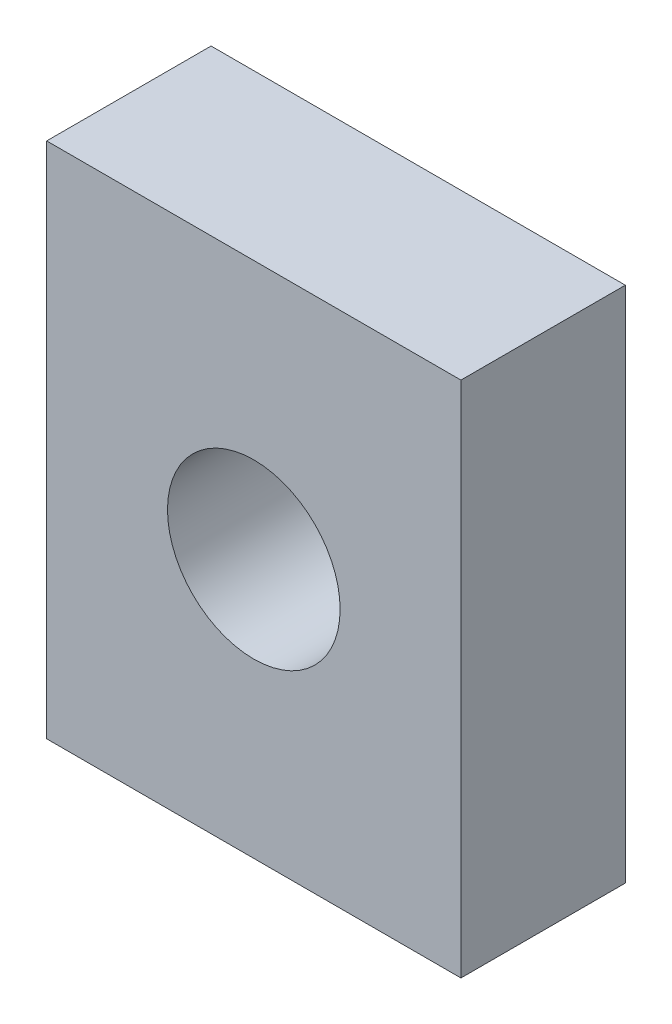
ISO-10303-21;
HEADER;
FILE_DESCRIPTION(('STEP AP214'),'2;1');
FILE_NAME('part.step','',(''),(''),'','','');
FILE_SCHEMA(('AUTOMOTIVE_DESIGN { 1 0 10303 214 1 1 1 1 }'));
ENDSEC;
DATA;
#1=APPLICATION_CONTEXT('core data for automotive mechanical design processes');
#2=APPLICATION_PROTOCOL_DEFINITION('international standard','automotive_design',2000,#1);
#3=PRODUCT_CONTEXT('',#1,'mechanical');
#4=PRODUCT('Part','Part','',(#3));
#5=PRODUCT_RELATED_PRODUCT_CATEGORY('part','',(#4));
#6=PRODUCT_DEFINITION_FORMATION('','',#4);
#7=PRODUCT_DEFINITION_CONTEXT('part definition',#1,'design');
#8=PRODUCT_DEFINITION('design','',#6,#7);
#9=PRODUCT_DEFINITION_SHAPE('','',#8);
#10=(LENGTH_UNIT() NAMED_UNIT(*) SI_UNIT(.MILLI.,.METRE.));
#11=(NAMED_UNIT(*) PLANE_ANGLE_UNIT() SI_UNIT($,.RADIAN.));
#12=(NAMED_UNIT(*) SI_UNIT($,.STERADIAN.) SOLID_ANGLE_UNIT());
#13=UNCERTAINTY_MEASURE_WITH_UNIT(LENGTH_MEASURE(1.E-05),#10,'distance_accuracy_value','');
#14=(GEOMETRIC_REPRESENTATION_CONTEXT(3) GLOBAL_UNCERTAINTY_ASSIGNED_CONTEXT((#13)) GLOBAL_UNIT_ASSIGNED_CONTEXT((#10,
#11,#12)) REPRESENTATION_CONTEXT('',''));
#15=CARTESIAN_POINT('',(0.,0.,0.));
#16=DIRECTION('',(0.,0.,1.));
#17=DIRECTION('',(1.,0.,0.));
#18=AXIS2_PLACEMENT_3D('',#15,#16,#17);
#19=CARTESIAN_POINT('',(60.,-75.,47.6190476190476));
#20=DIRECTION('',(0.,0.,1.));
#21=DIRECTION('',(1.,0.,0.));
#22=AXIS2_PLACEMENT_3D('',#19,#20,#21);
#23=PLANE('',#22);
#24=DIRECTION('',(0.,1.,0.));
#25=VECTOR('',#24,1.);
#26=CARTESIAN_POINT('',(60.,75.,47.6190476190476));
#27=LINE('',#26,#25);
#28=CARTESIAN_POINT('',(60.,-75.,47.6190476190476));
#29=VERTEX_POINT('',#28);
#30=CARTESIAN_POINT('',(60.,75.,47.6190476190476));
#31=VERTEX_POINT('',#30);
#32=EDGE_CURVE('E89',#29,#31,#27,.T.);
#33=ORIENTED_EDGE('',*,*,#32,.T.);
#34=DIRECTION('',(-1.,0.,0.));
#35=VECTOR('',#34,1.);
#36=CARTESIAN_POINT('',(-60.,75.,47.6190476190476));
#37=LINE('',#36,#35);
#38=CARTESIAN_POINT('',(-60.,75.,47.6190476190476));
#39=VERTEX_POINT('',#38);
#40=EDGE_CURVE('E84',#31,#39,#37,.T.);
#41=ORIENTED_EDGE('',*,*,#40,.T.);
#42=DIRECTION('',(0.,-1.,0.));
#43=VECTOR('',#42,1.);
#44=CARTESIAN_POINT('',(-60.,75.,47.6190476190476));
#45=LINE('',#44,#43);
#46=CARTESIAN_POINT('',(-60.,-75.,47.6190476190476));
#47=VERTEX_POINT('',#46);
#48=EDGE_CURVE('E87',#39,#47,#45,.T.);
#49=ORIENTED_EDGE('',*,*,#48,.T.);
#50=DIRECTION('',(1.,0.,0.));
#51=VECTOR('',#50,1.);
#52=CARTESIAN_POINT('',(-60.,-75.,47.6190476190476));
#53=LINE('',#52,#51);
#54=EDGE_CURVE('E54',#47,#29,#53,.T.);
#55=ORIENTED_EDGE('',*,*,#54,.T.);
#56=EDGE_LOOP('',(#33,#41,#49,#55));
#57=FACE_BOUND('',#56,.T.);
#58=CARTESIAN_POINT('',(0.,0.,47.6190476190476));
#59=DIRECTION('',(0.,0.,1.));
#60=DIRECTION('',(1.,0.,0.));
#61=AXIS2_PLACEMENT_3D('',#58,#59,#60);
#62=CIRCLE('',#61,25.);
#63=CARTESIAN_POINT('',(-25.,0.,47.6190476190476));
#64=VERTEX_POINT('',#63);
#65=EDGE_CURVE('E104',#64,#64,#62,.T.);
#66=ORIENTED_EDGE('',*,*,#65,.F.);
#67=EDGE_LOOP('',(#66));
#68=FACE_BOUND('',#67,.T.);
#69=ADVANCED_FACE('F37',(#57,#68),#23,.T.);
#70=CARTESIAN_POINT('',(60.,-75.,0.));
#71=DIRECTION('',(0.,0.,1.));
#72=DIRECTION('',(1.,0.,0.));
#73=AXIS2_PLACEMENT_3D('',#70,#71,#72);
#74=PLANE('',#73);
#75=DIRECTION('',(0.,1.,0.));
#76=VECTOR('',#75,1.);
#77=CARTESIAN_POINT('',(60.,75.,0.));
#78=LINE('',#77,#76);
#79=CARTESIAN_POINT('',(60.,-75.,0.));
#80=VERTEX_POINT('',#79);
#81=CARTESIAN_POINT('',(60.,75.,0.));
#82=VERTEX_POINT('',#81);
#83=EDGE_CURVE('E101',#80,#82,#78,.T.);
#84=ORIENTED_EDGE('',*,*,#83,.F.);
#85=DIRECTION('',(1.,0.,0.));
#86=VECTOR('',#85,1.);
#87=CARTESIAN_POINT('',(-60.,-75.,0.));
#88=LINE('',#87,#86);
#89=CARTESIAN_POINT('',(-60.,-75.,0.));
#90=VERTEX_POINT('',#89);
#91=EDGE_CURVE('E77',#90,#80,#88,.T.);
#92=ORIENTED_EDGE('',*,*,#91,.F.);
#93=DIRECTION('',(0.,-1.,0.));
#94=VECTOR('',#93,1.);
#95=CARTESIAN_POINT('',(-60.,75.,0.));
#96=LINE('',#95,#94);
#97=CARTESIAN_POINT('',(-60.,75.,0.));
#98=VERTEX_POINT('',#97);
#99=EDGE_CURVE('E71',#98,#90,#96,.T.);
#100=ORIENTED_EDGE('',*,*,#99,.F.);
#101=DIRECTION('',(-1.,0.,0.));
#102=VECTOR('',#101,1.);
#103=CARTESIAN_POINT('',(-60.,75.,0.));
#104=LINE('',#103,#102);
#105=EDGE_CURVE('E93',#82,#98,#104,.T.);
#106=ORIENTED_EDGE('',*,*,#105,.F.);
#107=EDGE_LOOP('',(#84,#92,#100,#106));
#108=FACE_BOUND('',#107,.T.);
#109=CARTESIAN_POINT('',(0.,0.,0.));
#110=DIRECTION('',(0.,0.,1.));
#111=DIRECTION('',(1.,0.,0.));
#112=AXIS2_PLACEMENT_3D('',#109,#110,#111);
#113=CIRCLE('',#112,25.);
#114=CARTESIAN_POINT('',(-25.,0.,0.));
#115=VERTEX_POINT('',#114);
#116=EDGE_CURVE('E116',#115,#115,#113,.T.);
#117=ORIENTED_EDGE('',*,*,#116,.T.);
#118=EDGE_LOOP('',(#117));
#119=FACE_BOUND('',#118,.T.);
#120=ADVANCED_FACE('F112',(#108,#119),#74,.F.);
#121=CARTESIAN_POINT('',(60.,75.,47.6190476190476));
#122=DIRECTION('',(-1.,0.,0.));
#123=DIRECTION('',(0.,-1.,0.));
#124=AXIS2_PLACEMENT_3D('',#121,#122,#123);
#125=PLANE('',#124);
#126=ORIENTED_EDGE('',*,*,#83,.T.);
#127=DIRECTION('',(0.,0.,-1.));
#128=VECTOR('',#127,1.);
#129=CARTESIAN_POINT('',(60.,75.,47.6190476190476));
#130=LINE('',#129,#128);
#131=EDGE_CURVE('E11',#31,#82,#130,.T.);
#132=ORIENTED_EDGE('',*,*,#131,.F.);
#133=ORIENTED_EDGE('',*,*,#32,.F.);
#134=DIRECTION('',(0.,0.,-1.));
#135=VECTOR('',#134,1.);
#136=CARTESIAN_POINT('',(60.,-75.,47.6190476190476));
#137=LINE('',#136,#135);
#138=EDGE_CURVE('E97',#29,#80,#137,.T.);
#139=ORIENTED_EDGE('',*,*,#138,.T.);
#140=EDGE_LOOP('',(#126,#132,#133,#139));
#141=FACE_BOUND('',#140,.T.);
#142=ADVANCED_FACE('F39',(#141),#125,.F.);
#143=CARTESIAN_POINT('',(-60.,75.,47.6190476190476));
#144=DIRECTION('',(0.,-1.,0.));
#145=DIRECTION('',(0.,0.,-1.));
#146=AXIS2_PLACEMENT_3D('',#143,#144,#145);
#147=PLANE('',#146);
#148=ORIENTED_EDGE('',*,*,#105,.T.);
#149=DIRECTION('',(0.,0.,-1.));
#150=VECTOR('',#149,1.);
#151=CARTESIAN_POINT('',(-60.,75.,47.6190476190476));
#152=LINE('',#151,#150);
#153=EDGE_CURVE('E46',#39,#98,#152,.T.);
#154=ORIENTED_EDGE('',*,*,#153,.F.);
#155=ORIENTED_EDGE('',*,*,#40,.F.);
#156=ORIENTED_EDGE('',*,*,#131,.T.);
#157=EDGE_LOOP('',(#148,#154,#155,#156));
#158=FACE_BOUND('',#157,.T.);
#159=ADVANCED_FACE('F92',(#158),#147,.F.);
#160=CARTESIAN_POINT('',(-60.,75.,47.6190476190476));
#161=DIRECTION('',(1.,0.,0.));
#162=DIRECTION('',(0.,1.,0.));
#163=AXIS2_PLACEMENT_3D('',#160,#161,#162);
#164=PLANE('',#163);
#165=ORIENTED_EDGE('',*,*,#99,.T.);
#166=DIRECTION('',(0.,0.,-1.));
#167=VECTOR('',#166,1.);
#168=CARTESIAN_POINT('',(-60.,-75.,47.6190476190476));
#169=LINE('',#168,#167);
#170=EDGE_CURVE('E94',#47,#90,#169,.T.);
#171=ORIENTED_EDGE('',*,*,#170,.F.);
#172=ORIENTED_EDGE('',*,*,#48,.F.);
#173=ORIENTED_EDGE('',*,*,#153,.T.);
#174=EDGE_LOOP('',(#165,#171,#172,#173));
#175=FACE_BOUND('',#174,.T.);
#176=ADVANCED_FACE('F95',(#175),#164,.F.);
#177=CARTESIAN_POINT('',(-60.,-75.,47.6190476190476));
#178=DIRECTION('',(0.,1.,0.));
#179=DIRECTION('',(0.,0.,1.));
#180=AXIS2_PLACEMENT_3D('',#177,#178,#179);
#181=PLANE('',#180);
#182=ORIENTED_EDGE('',*,*,#91,.T.);
#183=ORIENTED_EDGE('',*,*,#138,.F.);
#184=ORIENTED_EDGE('',*,*,#54,.F.);
#185=ORIENTED_EDGE('',*,*,#170,.T.);
#186=EDGE_LOOP('',(#182,#183,#184,#185));
#187=FACE_BOUND('',#186,.T.);
#188=ADVANCED_FACE('F109',(#187),#181,.F.);
#189=CARTESIAN_POINT('',(0.,0.,47.6190476190476));
#190=DIRECTION('',(0.,0.,-1.));
#191=DIRECTION('',(-1.,0.,0.));
#192=AXIS2_PLACEMENT_3D('',#189,#190,#191);
#193=CYLINDRICAL_SURFACE('',#192,25.);
#194=CARTESIAN_POINT('',(-25.,0.,47.6190476190476));
#195=CARTESIAN_POINT('',(-25.,0.,47.1230158730159));
#196=CARTESIAN_POINT('',(-25.,0.,46.6269841269841));
#197=CARTESIAN_POINT('',(-25.,0.,45.6349206349206));
#198=CARTESIAN_POINT('',(-25.,0.,45.1388888888889));
#199=CARTESIAN_POINT('',(-25.,0.,44.1468253968254));
#200=CARTESIAN_POINT('',(-25.,0.,43.6507936507936));
#201=CARTESIAN_POINT('',(-25.,0.,42.6587301587302));
#202=CARTESIAN_POINT('',(-25.,0.,42.1626984126984));
#203=CARTESIAN_POINT('',(-25.,0.,41.1706349206349));
#204=CARTESIAN_POINT('',(-25.,0.,40.6746031746032));
#205=CARTESIAN_POINT('',(-25.,0.,39.6825396825397));
#206=CARTESIAN_POINT('',(-25.,0.,39.1865079365079));
#207=CARTESIAN_POINT('',(-25.,0.,38.1944444444444));
#208=CARTESIAN_POINT('',(-25.,0.,37.6984126984127));
#209=CARTESIAN_POINT('',(-25.,0.,36.7063492063492));
#210=CARTESIAN_POINT('',(-25.,0.,36.2103174603175));
#211=CARTESIAN_POINT('',(-25.,0.,35.218253968254));
#212=CARTESIAN_POINT('',(-25.,0.,34.7222222222222));
#213=CARTESIAN_POINT('',(-25.,0.,33.7301587301587));
#214=CARTESIAN_POINT('',(-25.,0.,33.234126984127));
#215=CARTESIAN_POINT('',(-25.,0.,32.2420634920635));
#216=CARTESIAN_POINT('',(-25.,0.,31.7460317460317));
#217=CARTESIAN_POINT('',(-25.,0.,30.7539682539683));
#218=CARTESIAN_POINT('',(-25.,0.,30.2579365079365));
#219=CARTESIAN_POINT('',(-25.,0.,29.265873015873));
#220=CARTESIAN_POINT('',(-25.,0.,28.7698412698413));
#221=CARTESIAN_POINT('',(-25.,0.,27.7777777777778));
#222=CARTESIAN_POINT('',(-25.,0.,27.281746031746));
#223=CARTESIAN_POINT('',(-25.,0.,26.2896825396825));
#224=CARTESIAN_POINT('',(-25.,0.,25.7936507936508));
#225=CARTESIAN_POINT('',(-25.,0.,24.8015873015873));
#226=CARTESIAN_POINT('',(-25.,0.,24.3055555555556));
#227=CARTESIAN_POINT('',(-25.,0.,23.3134920634921));
#228=CARTESIAN_POINT('',(-25.,0.,22.8174603174603));
#229=CARTESIAN_POINT('',(-25.,0.,21.8253968253968));
#230=CARTESIAN_POINT('',(-25.,0.,21.3293650793651));
#231=CARTESIAN_POINT('',(-25.,0.,20.3373015873016));
#232=CARTESIAN_POINT('',(-25.,0.,19.8412698412698));
#233=CARTESIAN_POINT('',(-25.,0.,18.8492063492064));
#234=CARTESIAN_POINT('',(-25.,0.,18.3531746031746));
#235=CARTESIAN_POINT('',(-25.,0.,17.3611111111111));
#236=CARTESIAN_POINT('',(-25.,0.,16.8650793650794));
#237=CARTESIAN_POINT('',(-25.,0.,15.8730158730159));
#238=CARTESIAN_POINT('',(-25.,0.,15.3769841269841));
#239=CARTESIAN_POINT('',(-25.,0.,14.3849206349206));
#240=CARTESIAN_POINT('',(-25.,0.,13.8888888888889));
#241=CARTESIAN_POINT('',(-25.,0.,12.8968253968254));
#242=CARTESIAN_POINT('',(-25.,0.,12.4007936507937));
#243=CARTESIAN_POINT('',(-25.,0.,11.4087301587302));
#244=CARTESIAN_POINT('',(-25.,0.,10.9126984126984));
#245=CARTESIAN_POINT('',(-25.,0.,9.92063492063492));
#246=CARTESIAN_POINT('',(-25.,0.,9.42460317460318));
#247=CARTESIAN_POINT('',(-25.,0.,8.43253968253969));
#248=CARTESIAN_POINT('',(-25.,0.,7.93650793650794));
#249=CARTESIAN_POINT('',(-25.,0.,6.94444444444445));
#250=CARTESIAN_POINT('',(-25.,0.,6.4484126984127));
#251=CARTESIAN_POINT('',(-25.,0.,5.45634920634921));
#252=CARTESIAN_POINT('',(-25.,0.,4.96031746031746));
#253=CARTESIAN_POINT('',(-25.,0.,3.96825396825397));
#254=CARTESIAN_POINT('',(-25.,0.,3.47222222222222));
#255=CARTESIAN_POINT('',(-25.,0.,2.48015873015873));
#256=CARTESIAN_POINT('',(-25.,0.,1.98412698412699));
#257=CARTESIAN_POINT('',(-25.,0.,0.992063492063493));
#258=CARTESIAN_POINT('',(-25.,0.,0.496031746031747));
#259=CARTESIAN_POINT('',(-25.,0.,0.));
#260=B_SPLINE_CURVE_WITH_KNOTS('',3,(#194,#195,#196,#197,#198,#199,#200,#201,#202,#203,#204,
#205,#206,#207,#208,#209,#210,#211,#212,#213,#214,#215,#216,#217,#218,#219,#220,#221,#222,#223,
#224,#225,#226,#227,#228,#229,#230,#231,#232,#233,#234,#235,#236,#237,#238,#239,#240,#241,#242,
#243,#244,#245,#246,#247,#248,#249,#250,#251,#252,#253,#254,#255,#256,#257,#258,#259),
.UNSPECIFIED.,.F.,.F.,(4,2,2,2,2,2,2,2,2,2,2,2,2,2,2,2,2,2,2,2,2,2,2,2,2,2,2,2,2,2,2,2,4),(0.,
1.48809523809523,2.97619047619047,4.46428571428571,5.95238095238095,7.44047619047618,
8.92857142857143,10.4166666666667,11.9047619047619,13.3928571428571,14.8809523809524,
16.3690476190476,17.8571428571429,19.3452380952381,20.8333333333333,22.3214285714286,
23.8095238095238,25.297619047619,26.7857142857143,28.2738095238095,29.7619047619048,31.25,
32.7380952380952,34.2261904761905,35.7142857142857,37.2023809523809,38.6904761904762,
40.1785714285714,41.6666666666667,43.1547619047619,44.6428571428571,46.1309523809524,
47.6190476190476),.UNSPECIFIED.);
#261=EDGE_CURVE('BSEAM122',#64,#115,#260,.T.);
#262=ORIENTED_EDGE('',*,*,#65,.T.);
#263=ORIENTED_EDGE('',*,*,#116,.F.);
#264=ORIENTED_EDGE('',*,*,#261,.T.);
#265=ORIENTED_EDGE('',*,*,#261,.F.);
#266=EDGE_LOOP('',(#262,#264,#263,#265));
#267=FACE_BOUND('',#266,.T.);
#268=ADVANCED_FACE('F122',(#267),#193,.F.);
#269=CLOSED_SHELL('',(#69,#120,#142,#159,#176,#188,#268));
#270=MANIFOLD_SOLID_BREP('B2',#269);
#271=ADVANCED_BREP_SHAPE_REPRESENTATION('',(#18,#270),#14);
#272=SHAPE_DEFINITION_REPRESENTATION(#9,#271);
ENDSEC;
END-ISO-10303-21;
